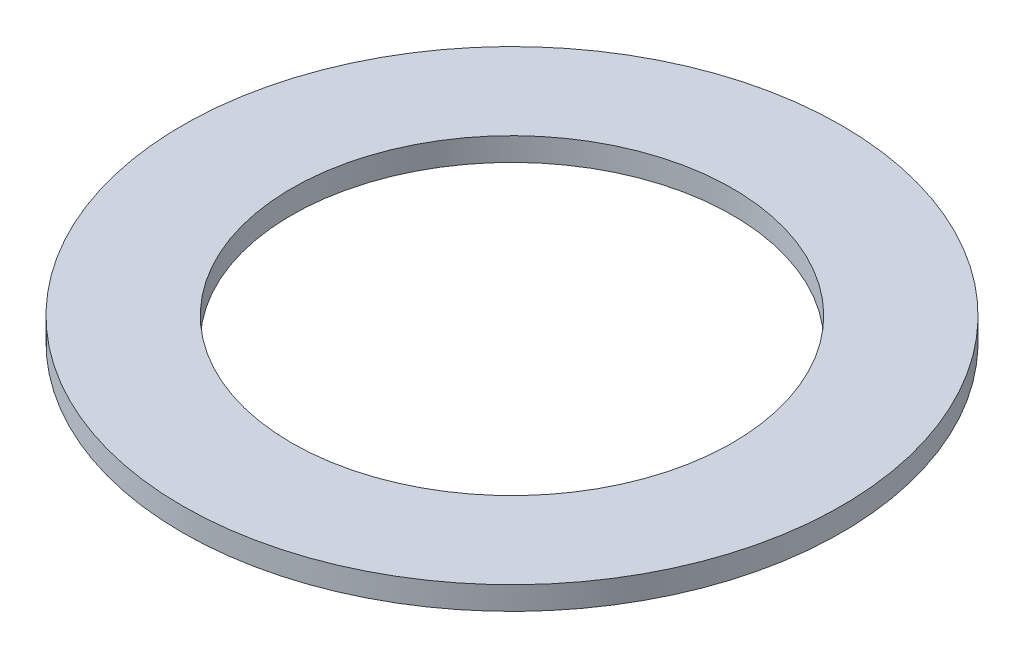
ISO-10303-21;
HEADER;
FILE_DESCRIPTION(('STEP AP214'),'2;1');
FILE_NAME('part.step','',(''),(''),'','','');
FILE_SCHEMA(('AUTOMOTIVE_DESIGN { 1 0 10303 214 1 1 1 1 }'));
ENDSEC;
DATA;
#1=APPLICATION_CONTEXT('core data for automotive mechanical design processes');
#2=APPLICATION_PROTOCOL_DEFINITION('international standard','automotive_design',2000,#1);
#3=PRODUCT_CONTEXT('',#1,'mechanical');
#4=PRODUCT('Part','Part','',(#3));
#5=PRODUCT_RELATED_PRODUCT_CATEGORY('part','',(#4));
#6=PRODUCT_DEFINITION_FORMATION('','',#4);
#7=PRODUCT_DEFINITION_CONTEXT('part definition',#1,'design');
#8=PRODUCT_DEFINITION('design','',#6,#7);
#9=PRODUCT_DEFINITION_SHAPE('','',#8);
#10=(LENGTH_UNIT() NAMED_UNIT(*) SI_UNIT(.MILLI.,.METRE.));
#11=(NAMED_UNIT(*) PLANE_ANGLE_UNIT() SI_UNIT($,.RADIAN.));
#12=(NAMED_UNIT(*) SI_UNIT($,.STERADIAN.) SOLID_ANGLE_UNIT());
#13=UNCERTAINTY_MEASURE_WITH_UNIT(LENGTH_MEASURE(1.E-05),#10,'distance_accuracy_value','');
#14=(GEOMETRIC_REPRESENTATION_CONTEXT(3) GLOBAL_UNCERTAINTY_ASSIGNED_CONTEXT((#13)) GLOBAL_UNIT_ASSIGNED_CONTEXT((#10,
#11,#12)) REPRESENTATION_CONTEXT('',''));
#15=CARTESIAN_POINT('',(0.,0.,0.));
#16=DIRECTION('',(0.,0.,1.));
#17=DIRECTION('',(1.,0.,0.));
#18=AXIS2_PLACEMENT_3D('',#15,#16,#17);
#19=CARTESIAN_POINT('',(0.,2.0066,0.));
#20=DIRECTION('',(0.,1.,0.));
#21=DIRECTION('',(0.,0.,1.));
#22=AXIS2_PLACEMENT_3D('',#19,#20,#21);
#23=PLANE('',#22);
#24=CARTESIAN_POINT('',(0.,2.0066,0.));
#25=DIRECTION('',(0.,1.,0.));
#26=DIRECTION('',(0.,0.,1.));
#27=AXIS2_PLACEMENT_3D('',#24,#25,#26);
#28=CIRCLE('',#27,28.575);
#29=CARTESIAN_POINT('',(0.,2.0066,28.575));
#30=VERTEX_POINT('',#29);
#31=EDGE_CURVE('E10',#30,#30,#28,.T.);
#32=ORIENTED_EDGE('',*,*,#31,.T.);
#33=EDGE_LOOP('',(#32));
#34=FACE_BOUND('',#33,.T.);
#35=CARTESIAN_POINT('',(0.,2.0066,0.));
#36=DIRECTION('',(0.,1.,0.));
#37=DIRECTION('',(0.,0.,1.));
#38=AXIS2_PLACEMENT_3D('',#35,#36,#37);
#39=CIRCLE('',#38,19.1135);
#40=CARTESIAN_POINT('',(0.,2.0066,19.1135));
#41=VERTEX_POINT('',#40);
#42=EDGE_CURVE('E55',#41,#41,#39,.T.);
#43=ORIENTED_EDGE('',*,*,#42,.F.);
#44=EDGE_LOOP('',(#43));
#45=FACE_BOUND('',#44,.T.);
#46=ADVANCED_FACE('F41',(#34,#45),#23,.T.);
#47=CARTESIAN_POINT('',(0.,0.,0.));
#48=DIRECTION('',(0.,1.,0.));
#49=DIRECTION('',(0.,0.,1.));
#50=AXIS2_PLACEMENT_3D('',#47,#48,#49);
#51=PLANE('',#50);
#52=CARTESIAN_POINT('',(0.,0.,0.));
#53=DIRECTION('',(0.,1.,0.));
#54=DIRECTION('',(0.,0.,1.));
#55=AXIS2_PLACEMENT_3D('',#52,#53,#54);
#56=CIRCLE('',#55,28.575);
#57=CARTESIAN_POINT('',(0.,0.,28.575));
#58=VERTEX_POINT('',#57);
#59=EDGE_CURVE('E45',#58,#58,#56,.T.);
#60=ORIENTED_EDGE('',*,*,#59,.F.);
#61=EDGE_LOOP('',(#60));
#62=FACE_BOUND('',#61,.T.);
#63=CARTESIAN_POINT('',(0.,0.,0.));
#64=DIRECTION('',(0.,1.,0.));
#65=DIRECTION('',(0.,0.,1.));
#66=AXIS2_PLACEMENT_3D('',#63,#64,#65);
#67=CIRCLE('',#66,19.1135);
#68=CARTESIAN_POINT('',(0.,0.,19.1135));
#69=VERTEX_POINT('',#68);
#70=EDGE_CURVE('E57',#69,#69,#67,.T.);
#71=ORIENTED_EDGE('',*,*,#70,.T.);
#72=EDGE_LOOP('',(#71));
#73=FACE_BOUND('',#72,.T.);
#74=ADVANCED_FACE('F70',(#62,#73),#51,.F.);
#75=CARTESIAN_POINT('',(0.,2.0066,0.));
#76=DIRECTION('',(0.,-1.,0.));
#77=DIRECTION('',(0.,0.,-1.));
#78=AXIS2_PLACEMENT_3D('',#75,#76,#77);
#79=CYLINDRICAL_SURFACE('',#78,28.575);
#80=ORIENTED_EDGE('',*,*,#31,.F.);
#81=EDGE_LOOP('',(#80));
#82=FACE_BOUND('',#81,.T.);
#83=ORIENTED_EDGE('',*,*,#59,.T.);
#84=EDGE_LOOP('',(#83));
#85=FACE_BOUND('',#84,.T.);
#86=ADVANCED_FACE('F43',(#82,#85),#79,.T.);
#87=CARTESIAN_POINT('',(0.,2.0066,0.));
#88=DIRECTION('',(0.,-1.,0.));
#89=DIRECTION('',(0.,0.,-1.));
#90=AXIS2_PLACEMENT_3D('',#87,#88,#89);
#91=CYLINDRICAL_SURFACE('',#90,19.1135);
#92=ORIENTED_EDGE('',*,*,#42,.T.);
#93=EDGE_LOOP('',(#92));
#94=FACE_BOUND('',#93,.T.);
#95=ORIENTED_EDGE('',*,*,#70,.F.);
#96=EDGE_LOOP('',(#95));
#97=FACE_BOUND('',#96,.T.);
#98=ADVANCED_FACE('F66',(#94,#97),#91,.F.);
#99=CLOSED_SHELL('',(#46,#74,#86,#98));
#100=MANIFOLD_SOLID_BREP('B2',#99);
#101=ADVANCED_BREP_SHAPE_REPRESENTATION('',(#18,#100),#14);
#102=SHAPE_DEFINITION_REPRESENTATION(#9,#101);
ENDSEC;
END-ISO-10303-21;
